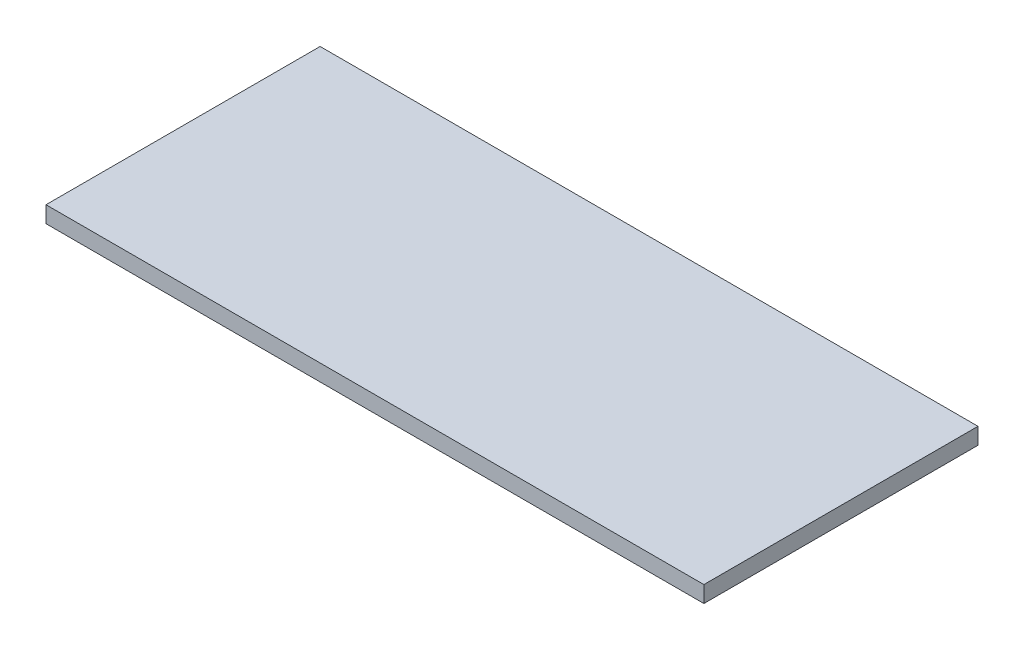
ISO-10303-21;
HEADER;
FILE_DESCRIPTION(('STEP AP214'),'2;1');
FILE_NAME('part.step','',(''),(''),'','','');
FILE_SCHEMA(('AUTOMOTIVE_DESIGN { 1 0 10303 214 1 1 1 1 }'));
ENDSEC;
DATA;
#1=APPLICATION_CONTEXT('core data for automotive mechanical design processes');
#2=APPLICATION_PROTOCOL_DEFINITION('international standard','automotive_design',2000,#1);
#3=PRODUCT_CONTEXT('',#1,'mechanical');
#4=PRODUCT('Part','Part','',(#3));
#5=PRODUCT_RELATED_PRODUCT_CATEGORY('part','',(#4));
#6=PRODUCT_DEFINITION_FORMATION('','',#4);
#7=PRODUCT_DEFINITION_CONTEXT('part definition',#1,'design');
#8=PRODUCT_DEFINITION('design','',#6,#7);
#9=PRODUCT_DEFINITION_SHAPE('','',#8);
#10=(LENGTH_UNIT() NAMED_UNIT(*) SI_UNIT(.MILLI.,.METRE.));
#11=(NAMED_UNIT(*) PLANE_ANGLE_UNIT() SI_UNIT($,.RADIAN.));
#12=(NAMED_UNIT(*) SI_UNIT($,.STERADIAN.) SOLID_ANGLE_UNIT());
#13=UNCERTAINTY_MEASURE_WITH_UNIT(LENGTH_MEASURE(1.E-05),#10,'distance_accuracy_value','');
#14=(GEOMETRIC_REPRESENTATION_CONTEXT(3) GLOBAL_UNCERTAINTY_ASSIGNED_CONTEXT((#13)) GLOBAL_UNIT_ASSIGNED_CONTEXT((#10,
#11,#12)) REPRESENTATION_CONTEXT('',''));
#15=CARTESIAN_POINT('',(0.,0.,0.));
#16=DIRECTION('',(0.,0.,1.));
#17=DIRECTION('',(1.,0.,0.));
#18=AXIS2_PLACEMENT_3D('',#15,#16,#17);
#19=CARTESIAN_POINT('',(0.,3.,0.));
#20=DIRECTION('',(1.,0.,0.));
#21=DIRECTION('',(0.,0.,-1.));
#22=AXIS2_PLACEMENT_3D('',#19,#20,#21);
#23=PLANE('',#22);
#24=DIRECTION('',(0.,0.,1.));
#25=VECTOR('',#24,1.);
#26=CARTESIAN_POINT('',(0.,0.,0.));
#27=LINE('',#26,#25);
#28=CARTESIAN_POINT('',(0.,0.,-50.));
#29=VERTEX_POINT('',#28);
#30=CARTESIAN_POINT('',(0.,0.,0.));
#31=VERTEX_POINT('',#30);
#32=EDGE_CURVE('E95',#29,#31,#27,.T.);
#33=ORIENTED_EDGE('',*,*,#32,.T.);
#34=DIRECTION('',(0.,-1.,0.));
#35=VECTOR('',#34,1.);
#36=CARTESIAN_POINT('',(0.,3.,0.));
#37=LINE('',#36,#35);
#38=CARTESIAN_POINT('',(0.,3.,0.));
#39=VERTEX_POINT('',#38);
#40=EDGE_CURVE('E11',#39,#31,#37,.T.);
#41=ORIENTED_EDGE('',*,*,#40,.F.);
#42=DIRECTION('',(0.,0.,1.));
#43=VECTOR('',#42,1.);
#44=CARTESIAN_POINT('',(0.,3.,0.));
#45=LINE('',#44,#43);
#46=CARTESIAN_POINT('',(0.,3.,-50.));
#47=VERTEX_POINT('',#46);
#48=EDGE_CURVE('E83',#47,#39,#45,.T.);
#49=ORIENTED_EDGE('',*,*,#48,.F.);
#50=DIRECTION('',(0.,-1.,0.));
#51=VECTOR('',#50,1.);
#52=CARTESIAN_POINT('',(0.,3.,-50.));
#53=LINE('',#52,#51);
#54=EDGE_CURVE('E91',#47,#29,#53,.T.);
#55=ORIENTED_EDGE('',*,*,#54,.T.);
#56=EDGE_LOOP('',(#33,#41,#49,#55));
#57=FACE_BOUND('',#56,.T.);
#58=ADVANCED_FACE('F32',(#57),#23,.F.);
#59=CARTESIAN_POINT('',(0.,3.,0.));
#60=DIRECTION('',(0.,0.,-1.));
#61=DIRECTION('',(-1.,0.,0.));
#62=AXIS2_PLACEMENT_3D('',#59,#60,#61);
#63=PLANE('',#62);
#64=DIRECTION('',(1.,0.,0.));
#65=VECTOR('',#64,1.);
#66=CARTESIAN_POINT('',(0.,0.,0.));
#67=LINE('',#66,#65);
#68=CARTESIAN_POINT('',(120.,0.,0.));
#69=VERTEX_POINT('',#68);
#70=EDGE_CURVE('E87',#31,#69,#67,.T.);
#71=ORIENTED_EDGE('',*,*,#70,.T.);
#72=DIRECTION('',(0.,-1.,0.));
#73=VECTOR('',#72,1.);
#74=CARTESIAN_POINT('',(120.,3.,0.));
#75=LINE('',#74,#73);
#76=CARTESIAN_POINT('',(120.,3.,0.));
#77=VERTEX_POINT('',#76);
#78=EDGE_CURVE('E40',#77,#69,#75,.T.);
#79=ORIENTED_EDGE('',*,*,#78,.F.);
#80=DIRECTION('',(1.,0.,0.));
#81=VECTOR('',#80,1.);
#82=CARTESIAN_POINT('',(0.,3.,0.));
#83=LINE('',#82,#81);
#84=EDGE_CURVE('E78',#39,#77,#83,.T.);
#85=ORIENTED_EDGE('',*,*,#84,.F.);
#86=ORIENTED_EDGE('',*,*,#40,.T.);
#87=EDGE_LOOP('',(#71,#79,#85,#86));
#88=FACE_BOUND('',#87,.T.);
#89=ADVANCED_FACE('F86',(#88),#63,.F.);
#90=CARTESIAN_POINT('',(120.,3.,0.));
#91=DIRECTION('',(-1.,0.,0.));
#92=DIRECTION('',(0.,0.,1.));
#93=AXIS2_PLACEMENT_3D('',#90,#91,#92);
#94=PLANE('',#93);
#95=DIRECTION('',(0.,0.,-1.));
#96=VECTOR('',#95,1.);
#97=CARTESIAN_POINT('',(120.,0.,0.));
#98=LINE('',#97,#96);
#99=CARTESIAN_POINT('',(120.,0.,-50.));
#100=VERTEX_POINT('',#99);
#101=EDGE_CURVE('E65',#69,#100,#98,.T.);
#102=ORIENTED_EDGE('',*,*,#101,.T.);
#103=DIRECTION('',(0.,-1.,0.));
#104=VECTOR('',#103,1.);
#105=CARTESIAN_POINT('',(120.,3.,-50.));
#106=LINE('',#105,#104);
#107=CARTESIAN_POINT('',(120.,3.,-50.));
#108=VERTEX_POINT('',#107);
#109=EDGE_CURVE('E88',#108,#100,#106,.T.);
#110=ORIENTED_EDGE('',*,*,#109,.F.);
#111=DIRECTION('',(0.,0.,-1.));
#112=VECTOR('',#111,1.);
#113=CARTESIAN_POINT('',(120.,3.,0.));
#114=LINE('',#113,#112);
#115=EDGE_CURVE('E81',#77,#108,#114,.T.);
#116=ORIENTED_EDGE('',*,*,#115,.F.);
#117=ORIENTED_EDGE('',*,*,#78,.T.);
#118=EDGE_LOOP('',(#102,#110,#116,#117));
#119=FACE_BOUND('',#118,.T.);
#120=ADVANCED_FACE('F89',(#119),#94,.F.);
#121=CARTESIAN_POINT('',(0.,3.,-50.));
#122=DIRECTION('',(0.,0.,1.));
#123=DIRECTION('',(1.,0.,0.));
#124=AXIS2_PLACEMENT_3D('',#121,#122,#123);
#125=PLANE('',#124);
#126=DIRECTION('',(-1.,0.,0.));
#127=VECTOR('',#126,1.);
#128=CARTESIAN_POINT('',(0.,0.,-50.));
#129=LINE('',#128,#127);
#130=EDGE_CURVE('E71',#100,#29,#129,.T.);
#131=ORIENTED_EDGE('',*,*,#130,.T.);
#132=ORIENTED_EDGE('',*,*,#54,.F.);
#133=DIRECTION('',(-1.,0.,0.));
#134=VECTOR('',#133,1.);
#135=CARTESIAN_POINT('',(0.,3.,-50.));
#136=LINE('',#135,#134);
#137=EDGE_CURVE('E48',#108,#47,#136,.T.);
#138=ORIENTED_EDGE('',*,*,#137,.F.);
#139=ORIENTED_EDGE('',*,*,#109,.T.);
#140=EDGE_LOOP('',(#131,#132,#138,#139));
#141=FACE_BOUND('',#140,.T.);
#142=ADVANCED_FACE('F102',(#141),#125,.F.);
#143=CARTESIAN_POINT('',(0.,3.,0.));
#144=DIRECTION('',(0.,-1.,0.));
#145=DIRECTION('',(0.,0.,-1.));
#146=AXIS2_PLACEMENT_3D('',#143,#144,#145);
#147=PLANE('',#146);
#148=ORIENTED_EDGE('',*,*,#48,.T.);
#149=ORIENTED_EDGE('',*,*,#84,.T.);
#150=ORIENTED_EDGE('',*,*,#115,.T.);
#151=ORIENTED_EDGE('',*,*,#137,.T.);
#152=EDGE_LOOP('',(#148,#149,#150,#151));
#153=FACE_BOUND('',#152,.T.);
#154=ADVANCED_FACE('F79',(#153),#147,.F.);
#155=CARTESIAN_POINT('',(0.,0.,0.));
#156=DIRECTION('',(0.,-1.,0.));
#157=DIRECTION('',(0.,0.,-1.));
#158=AXIS2_PLACEMENT_3D('',#155,#156,#157);
#159=PLANE('',#158);
#160=ORIENTED_EDGE('',*,*,#32,.F.);
#161=ORIENTED_EDGE('',*,*,#130,.F.);
#162=ORIENTED_EDGE('',*,*,#101,.F.);
#163=ORIENTED_EDGE('',*,*,#70,.F.);
#164=EDGE_LOOP('',(#160,#161,#162,#163));
#165=FACE_BOUND('',#164,.T.);
#166=ADVANCED_FACE('F105',(#165),#159,.T.);
#167=CLOSED_SHELL('',(#58,#89,#120,#142,#154,#166));
#168=MANIFOLD_SOLID_BREP('B2',#167);
#169=ADVANCED_BREP_SHAPE_REPRESENTATION('',(#18,#168),#14);
#170=SHAPE_DEFINITION_REPRESENTATION(#9,#169);
ENDSEC;
END-ISO-10303-21;
